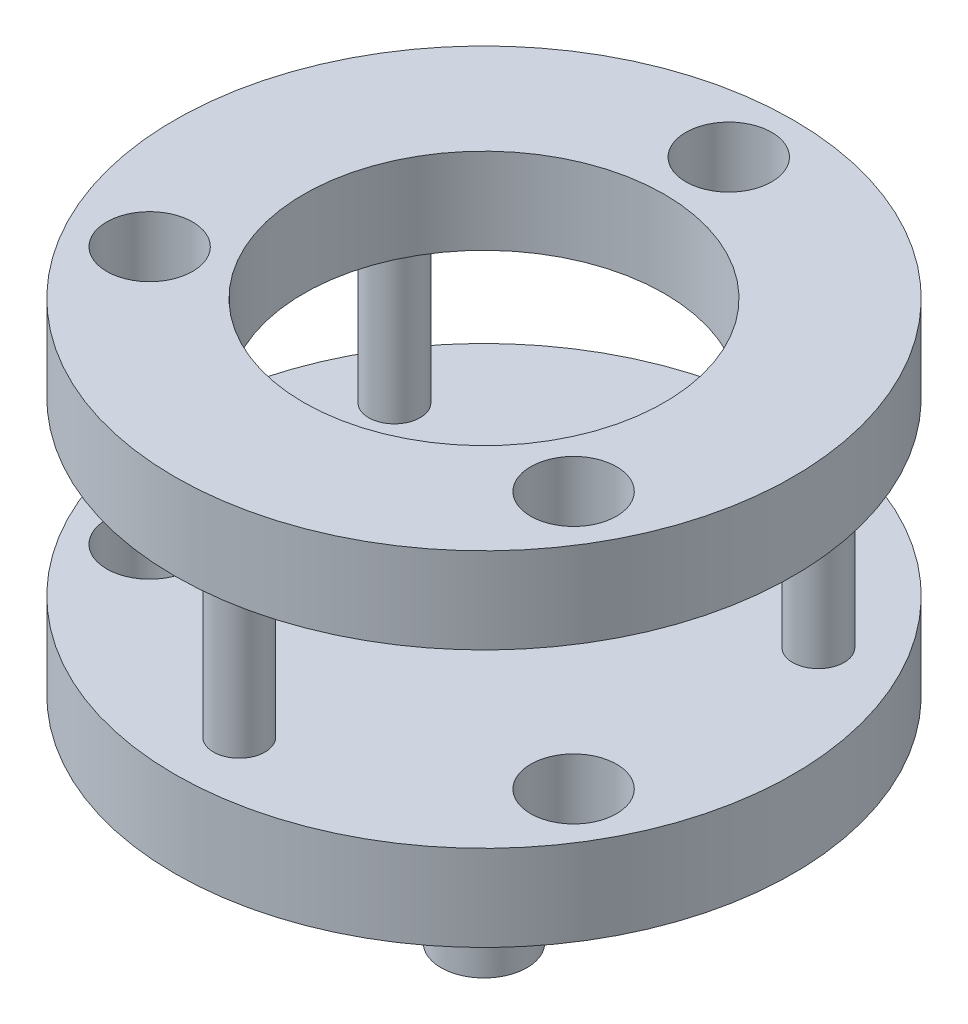
ISO-10303-21;
HEADER;
FILE_DESCRIPTION(('STEP AP214'),'2;1');
FILE_NAME('part.step','',(''),(''),'','','');
FILE_SCHEMA(('AUTOMOTIVE_DESIGN { 1 0 10303 214 1 1 1 1 }'));
ENDSEC;
DATA;
#1=APPLICATION_CONTEXT('core data for automotive mechanical design processes');
#2=APPLICATION_PROTOCOL_DEFINITION('international standard','automotive_design',2000,#1);
#3=PRODUCT_CONTEXT('',#1,'mechanical');
#4=PRODUCT('Part','Part','',(#3));
#5=PRODUCT_RELATED_PRODUCT_CATEGORY('part','',(#4));
#6=PRODUCT_DEFINITION_FORMATION('','',#4);
#7=PRODUCT_DEFINITION_CONTEXT('part definition',#1,'design');
#8=PRODUCT_DEFINITION('design','',#6,#7);
#9=PRODUCT_DEFINITION_SHAPE('','',#8);
#10=(LENGTH_UNIT() NAMED_UNIT(*) SI_UNIT(.MILLI.,.METRE.));
#11=(NAMED_UNIT(*) PLANE_ANGLE_UNIT() SI_UNIT($,.RADIAN.));
#12=(NAMED_UNIT(*) SI_UNIT($,.STERADIAN.) SOLID_ANGLE_UNIT());
#13=UNCERTAINTY_MEASURE_WITH_UNIT(LENGTH_MEASURE(1.E-05),#10,'distance_accuracy_value','');
#14=(GEOMETRIC_REPRESENTATION_CONTEXT(3) GLOBAL_UNCERTAINTY_ASSIGNED_CONTEXT((#13)) GLOBAL_UNIT_ASSIGNED_CONTEXT((#10,
#11,#12)) REPRESENTATION_CONTEXT('',''));
#15=CARTESIAN_POINT('',(0.,0.,0.));
#16=DIRECTION('',(0.,0.,1.));
#17=DIRECTION('',(1.,0.,0.));
#18=AXIS2_PLACEMENT_3D('',#15,#16,#17);
#19=CARTESIAN_POINT('',(24.6817240078567,40.,-14.2500000000001));
#20=DIRECTION('',(0.,-1.,0.));
#21=DIRECTION('',(0.,0.,-1.));
#22=AXIS2_PLACEMENT_3D('',#19,#20,#21);
#23=CYLINDRICAL_SURFACE('',#22,2.99999999999999);
#24=CARTESIAN_POINT('',(24.6817240078567,10.,-14.2500000000001));
#25=DIRECTION('',(0.,1.,0.));
#26=DIRECTION('',(0.,0.,1.));
#27=AXIS2_PLACEMENT_3D('',#24,#25,#26);
#28=CIRCLE('',#27,2.99999999999999);
#29=CARTESIAN_POINT('',(24.6817240078567,10.,-11.2500000000001));
#30=VERTEX_POINT('',#29);
#31=EDGE_CURVE('E78',#30,#30,#28,.T.);
#32=ORIENTED_EDGE('',*,*,#31,.T.);
#33=EDGE_LOOP('',(#32));
#34=FACE_BOUND('',#33,.T.);
#35=CARTESIAN_POINT('',(24.6817240078567,30.,-14.2500000000001));
#36=DIRECTION('',(0.,1.,0.));
#37=DIRECTION('',(0.,0.,1.));
#38=AXIS2_PLACEMENT_3D('',#35,#36,#37);
#39=CIRCLE('',#38,2.99999999999999);
#40=CARTESIAN_POINT('',(24.6817240078567,30.,-11.2500000000001));
#41=VERTEX_POINT('',#40);
#42=EDGE_CURVE('E58',#41,#41,#39,.T.);
#43=ORIENTED_EDGE('',*,*,#42,.F.);
#44=EDGE_LOOP('',(#43));
#45=FACE_BOUND('',#44,.T.);
#46=ADVANCED_FACE('F45',(#34,#45),#23,.T.);
#47=CARTESIAN_POINT('',(-24.6817240078567,40.,-14.2500000000001));
#48=DIRECTION('',(0.,-1.,0.));
#49=DIRECTION('',(0.,0.,-1.));
#50=AXIS2_PLACEMENT_3D('',#47,#48,#49);
#51=CYLINDRICAL_SURFACE('',#50,3.);
#52=CARTESIAN_POINT('',(-24.6817240078567,10.,-14.2500000000001));
#53=DIRECTION('',(0.,1.,0.));
#54=DIRECTION('',(0.,0.,1.));
#55=AXIS2_PLACEMENT_3D('',#52,#53,#54);
#56=CIRCLE('',#55,3.);
#57=CARTESIAN_POINT('',(-24.6817240078567,10.,-11.2500000000001));
#58=VERTEX_POINT('',#57);
#59=EDGE_CURVE('E99',#58,#58,#56,.T.);
#60=ORIENTED_EDGE('',*,*,#59,.T.);
#61=EDGE_LOOP('',(#60));
#62=FACE_BOUND('',#61,.T.);
#63=CARTESIAN_POINT('',(-24.6817240078567,30.,-14.2500000000001));
#64=DIRECTION('',(0.,1.,0.));
#65=DIRECTION('',(0.,0.,1.));
#66=AXIS2_PLACEMENT_3D('',#63,#64,#65);
#67=CIRCLE('',#66,3.);
#68=CARTESIAN_POINT('',(-24.6817240078567,30.,-11.2500000000001));
#69=VERTEX_POINT('',#68);
#70=EDGE_CURVE('E63',#69,#69,#67,.T.);
#71=ORIENTED_EDGE('',*,*,#70,.F.);
#72=EDGE_LOOP('',(#71));
#73=FACE_BOUND('',#72,.T.);
#74=ADVANCED_FACE('F180',(#62,#73),#51,.T.);
#75=CARTESIAN_POINT('',(0.,40.,28.5000000000002));
#76=DIRECTION('',(0.,-1.,0.));
#77=DIRECTION('',(0.,0.,-1.));
#78=AXIS2_PLACEMENT_3D('',#75,#76,#77);
#79=CYLINDRICAL_SURFACE('',#78,3.);
#80=CARTESIAN_POINT('',(0.,10.,28.5000000000002));
#81=DIRECTION('',(0.,1.,0.));
#82=DIRECTION('',(0.,0.,1.));
#83=AXIS2_PLACEMENT_3D('',#80,#81,#82);
#84=CIRCLE('',#83,3.);
#85=CARTESIAN_POINT('',(0.,10.,31.5000000000002));
#86=VERTEX_POINT('',#85);
#87=EDGE_CURVE('E107',#86,#86,#84,.T.);
#88=ORIENTED_EDGE('',*,*,#87,.T.);
#89=EDGE_LOOP('',(#88));
#90=FACE_BOUND('',#89,.T.);
#91=CARTESIAN_POINT('',(0.,30.,28.5000000000002));
#92=DIRECTION('',(0.,1.,0.));
#93=DIRECTION('',(0.,0.,1.));
#94=AXIS2_PLACEMENT_3D('',#91,#92,#93);
#95=CIRCLE('',#94,3.);
#96=CARTESIAN_POINT('',(0.,30.,31.5000000000002));
#97=VERTEX_POINT('',#96);
#98=EDGE_CURVE('E69',#97,#97,#95,.T.);
#99=ORIENTED_EDGE('',*,*,#98,.F.);
#100=EDGE_LOOP('',(#99));
#101=FACE_BOUND('',#100,.T.);
#102=ADVANCED_FACE('F187',(#90,#101),#79,.T.);
#103=CARTESIAN_POINT('',(0.,10.,0.));
#104=DIRECTION('',(0.,-1.,0.));
#105=DIRECTION('',(0.,0.,-1.));
#106=AXIS2_PLACEMENT_3D('',#103,#104,#105);
#107=CYLINDRICAL_SURFACE('',#106,36.0000000000002);
#108=CARTESIAN_POINT('',(0.,10.,0.));
#109=DIRECTION('',(0.,1.,0.));
#110=DIRECTION('',(0.,0.,1.));
#111=AXIS2_PLACEMENT_3D('',#108,#109,#110);
#112=CIRCLE('',#111,36.0000000000002);
#113=CARTESIAN_POINT('',(0.,10.,36.0000000000002));
#114=VERTEX_POINT('',#113);
#115=EDGE_CURVE('E73',#114,#114,#112,.T.);
#116=ORIENTED_EDGE('',*,*,#115,.F.);
#117=EDGE_LOOP('',(#116));
#118=FACE_BOUND('',#117,.T.);
#119=CARTESIAN_POINT('',(0.,0.,0.));
#120=DIRECTION('',(0.,1.,0.));
#121=DIRECTION('',(0.,0.,1.));
#122=AXIS2_PLACEMENT_3D('',#119,#120,#121);
#123=CIRCLE('',#122,36.0000000000002);
#124=CARTESIAN_POINT('',(0.,0.,36.0000000000002));
#125=VERTEX_POINT('',#124);
#126=EDGE_CURVE('E74',#125,#125,#123,.T.);
#127=ORIENTED_EDGE('',*,*,#126,.T.);
#128=EDGE_LOOP('',(#127));
#129=FACE_BOUND('',#128,.T.);
#130=ADVANCED_FACE('F201',(#118,#129),#107,.T.);
#131=CARTESIAN_POINT('',(0.,10.,-28.5000000000003));
#132=DIRECTION('',(0.,-1.,0.));
#133=DIRECTION('',(0.,0.,-1.));
#134=AXIS2_PLACEMENT_3D('',#131,#132,#133);
#135=CYLINDRICAL_SURFACE('',#134,5.00000000000001);
#136=CARTESIAN_POINT('',(0.,10.,-28.5000000000003));
#137=DIRECTION('',(0.,1.,0.));
#138=DIRECTION('',(0.,0.,1.));
#139=AXIS2_PLACEMENT_3D('',#136,#137,#138);
#140=CIRCLE('',#139,5.00000000000001);
#141=CARTESIAN_POINT('',(0.,10.,-23.5000000000003));
#142=VERTEX_POINT('',#141);
#143=EDGE_CURVE('E95',#142,#142,#140,.T.);
#144=ORIENTED_EDGE('',*,*,#143,.T.);
#145=EDGE_LOOP('',(#144));
#146=FACE_BOUND('',#145,.T.);
#147=CARTESIAN_POINT('',(0.,0.,-28.5000000000003));
#148=DIRECTION('',(0.,1.,0.));
#149=DIRECTION('',(0.,0.,1.));
#150=AXIS2_PLACEMENT_3D('',#147,#148,#149);
#151=CIRCLE('',#150,5.00000000000001);
#152=CARTESIAN_POINT('',(0.,0.,-23.5000000000003));
#153=VERTEX_POINT('',#152);
#154=EDGE_CURVE('E79',#153,#153,#151,.T.);
#155=ORIENTED_EDGE('',*,*,#154,.F.);
#156=EDGE_LOOP('',(#155));
#157=FACE_BOUND('',#156,.T.);
#158=ADVANCED_FACE('F204',(#146,#157),#135,.F.);
#159=CARTESIAN_POINT('',(-24.6817240078564,10.,14.2500000000001));
#160=DIRECTION('',(0.,-1.,0.));
#161=DIRECTION('',(0.,0.,-1.));
#162=AXIS2_PLACEMENT_3D('',#159,#160,#161);
#163=CYLINDRICAL_SURFACE('',#162,5.);
#164=CARTESIAN_POINT('',(-24.6817240078564,10.,14.2500000000001));
#165=DIRECTION('',(0.,1.,0.));
#166=DIRECTION('',(0.,0.,1.));
#167=AXIS2_PLACEMENT_3D('',#164,#165,#166);
#168=CIRCLE('',#167,5.);
#169=CARTESIAN_POINT('',(-24.6817240078564,10.,19.2500000000001));
#170=VERTEX_POINT('',#169);
#171=EDGE_CURVE('E103',#170,#170,#168,.T.);
#172=ORIENTED_EDGE('',*,*,#171,.T.);
#173=EDGE_LOOP('',(#172));
#174=FACE_BOUND('',#173,.T.);
#175=CARTESIAN_POINT('',(-24.6817240078564,0.,14.2500000000001));
#176=DIRECTION('',(0.,1.,0.));
#177=DIRECTION('',(0.,0.,1.));
#178=AXIS2_PLACEMENT_3D('',#175,#176,#177);
#179=CIRCLE('',#178,5.);
#180=CARTESIAN_POINT('',(-24.6817240078564,0.,19.2500000000001));
#181=VERTEX_POINT('',#180);
#182=EDGE_CURVE('E83',#181,#181,#179,.T.);
#183=ORIENTED_EDGE('',*,*,#182,.F.);
#184=EDGE_LOOP('',(#183));
#185=FACE_BOUND('',#184,.T.);
#186=ADVANCED_FACE('F208',(#174,#185),#163,.F.);
#187=CARTESIAN_POINT('',(24.6817240078568,10.,14.2499999999999));
#188=DIRECTION('',(0.,-1.,0.));
#189=DIRECTION('',(0.,0.,-1.));
#190=AXIS2_PLACEMENT_3D('',#187,#188,#189);
#191=CYLINDRICAL_SURFACE('',#190,5.00000000000002);
#192=CARTESIAN_POINT('',(24.6817240078568,10.,14.2499999999999));
#193=DIRECTION('',(0.,1.,0.));
#194=DIRECTION('',(0.,0.,1.));
#195=AXIS2_PLACEMENT_3D('',#192,#193,#194);
#196=CIRCLE('',#195,5.00000000000002);
#197=CARTESIAN_POINT('',(24.6817240078568,10.,19.2499999999999));
#198=VERTEX_POINT('',#197);
#199=EDGE_CURVE('E111',#198,#198,#196,.T.);
#200=ORIENTED_EDGE('',*,*,#199,.T.);
#201=EDGE_LOOP('',(#200));
#202=FACE_BOUND('',#201,.T.);
#203=CARTESIAN_POINT('',(24.6817240078568,0.,14.2499999999999));
#204=DIRECTION('',(0.,1.,0.));
#205=DIRECTION('',(0.,0.,1.));
#206=AXIS2_PLACEMENT_3D('',#203,#204,#205);
#207=CIRCLE('',#206,5.00000000000002);
#208=CARTESIAN_POINT('',(24.6817240078568,0.,19.2499999999999));
#209=VERTEX_POINT('',#208);
#210=EDGE_CURVE('E87',#209,#209,#207,.T.);
#211=ORIENTED_EDGE('',*,*,#210,.F.);
#212=EDGE_LOOP('',(#211));
#213=FACE_BOUND('',#212,.T.);
#214=ADVANCED_FACE('F197',(#202,#213),#191,.F.);
#215=CARTESIAN_POINT('',(0.,10.,0.));
#216=DIRECTION('',(0.,1.,0.));
#217=DIRECTION('',(0.,0.,1.));
#218=AXIS2_PLACEMENT_3D('',#215,#216,#217);
#219=PLANE('',#218);
#220=ORIENTED_EDGE('',*,*,#31,.F.);
#221=EDGE_LOOP('',(#220));
#222=FACE_BOUND('',#221,.T.);
#223=ORIENTED_EDGE('',*,*,#199,.F.);
#224=EDGE_LOOP('',(#223));
#225=FACE_BOUND('',#224,.T.);
#226=ORIENTED_EDGE('',*,*,#87,.F.);
#227=EDGE_LOOP('',(#226));
#228=FACE_BOUND('',#227,.T.);
#229=ORIENTED_EDGE('',*,*,#171,.F.);
#230=EDGE_LOOP('',(#229));
#231=FACE_BOUND('',#230,.T.);
#232=ORIENTED_EDGE('',*,*,#59,.F.);
#233=EDGE_LOOP('',(#232));
#234=FACE_BOUND('',#233,.T.);
#235=ORIENTED_EDGE('',*,*,#143,.F.);
#236=EDGE_LOOP('',(#235));
#237=FACE_BOUND('',#236,.T.);
#238=ORIENTED_EDGE('',*,*,#115,.T.);
#239=EDGE_LOOP('',(#238));
#240=FACE_BOUND('',#239,.T.);
#241=ADVANCED_FACE('F193',(#222,#225,#228,#231,#234,#237,#240),#219,.T.);
#242=CARTESIAN_POINT('',(0.,0.,0.));
#243=DIRECTION('',(0.,1.,0.));
#244=DIRECTION('',(0.,0.,1.));
#245=AXIS2_PLACEMENT_3D('',#242,#243,#244);
#246=PLANE('',#245);
#247=CARTESIAN_POINT('',(0.,0.,0.));
#248=DIRECTION('',(0.,1.,0.));
#249=DIRECTION('',(0.,0.,1.));
#250=AXIS2_PLACEMENT_3D('',#247,#248,#249);
#251=CIRCLE('',#250,15.);
#252=CARTESIAN_POINT('',(0.,0.,15.));
#253=VERTEX_POINT('',#252);
#254=EDGE_CURVE('E10',#253,#253,#251,.T.);
#255=ORIENTED_EDGE('',*,*,#254,.T.);
#256=EDGE_LOOP('',(#255));
#257=FACE_BOUND('',#256,.T.);
#258=ORIENTED_EDGE('',*,*,#210,.T.);
#259=EDGE_LOOP('',(#258));
#260=FACE_BOUND('',#259,.T.);
#261=ORIENTED_EDGE('',*,*,#182,.T.);
#262=EDGE_LOOP('',(#261));
#263=FACE_BOUND('',#262,.T.);
#264=ORIENTED_EDGE('',*,*,#154,.T.);
#265=EDGE_LOOP('',(#264));
#266=FACE_BOUND('',#265,.T.);
#267=ORIENTED_EDGE('',*,*,#126,.F.);
#268=EDGE_LOOP('',(#267));
#269=FACE_BOUND('',#268,.T.);
#270=ADVANCED_FACE('F196',(#257,#260,#263,#266,#269),#246,.F.);
#271=CARTESIAN_POINT('',(0.,40.,0.));
#272=DIRECTION('',(0.,-1.,0.));
#273=DIRECTION('',(0.,0.,-1.));
#274=AXIS2_PLACEMENT_3D('',#271,#272,#273);
#275=CYLINDRICAL_SURFACE('',#274,36.0000000000002);
#276=CARTESIAN_POINT('',(0.,40.,0.));
#277=DIRECTION('',(0.,1.,0.));
#278=DIRECTION('',(0.,0.,1.));
#279=AXIS2_PLACEMENT_3D('',#276,#277,#278);
#280=CIRCLE('',#279,36.0000000000002);
#281=CARTESIAN_POINT('',(0.,40.,36.0000000000002));
#282=VERTEX_POINT('',#281);
#283=EDGE_CURVE('E143',#282,#282,#280,.T.);
#284=ORIENTED_EDGE('',*,*,#283,.F.);
#285=EDGE_LOOP('',(#284));
#286=FACE_BOUND('',#285,.T.);
#287=CARTESIAN_POINT('',(0.,30.,0.));
#288=DIRECTION('',(0.,1.,0.));
#289=DIRECTION('',(0.,0.,1.));
#290=AXIS2_PLACEMENT_3D('',#287,#288,#289);
#291=CIRCLE('',#290,36.0000000000002);
#292=CARTESIAN_POINT('',(0.,30.,36.0000000000002));
#293=VERTEX_POINT('',#292);
#294=EDGE_CURVE('E123',#293,#293,#291,.T.);
#295=ORIENTED_EDGE('',*,*,#294,.T.);
#296=EDGE_LOOP('',(#295));
#297=FACE_BOUND('',#296,.T.);
#298=ADVANCED_FACE('F200',(#286,#297),#275,.T.);
#299=CARTESIAN_POINT('',(0.,40.,-28.5000000000003));
#300=DIRECTION('',(0.,-1.,0.));
#301=DIRECTION('',(0.,0.,-1.));
#302=AXIS2_PLACEMENT_3D('',#299,#300,#301);
#303=CYLINDRICAL_SURFACE('',#302,5.00000000000001);
#304=CARTESIAN_POINT('',(0.,40.,-28.5000000000003));
#305=DIRECTION('',(0.,1.,0.));
#306=DIRECTION('',(0.,0.,1.));
#307=AXIS2_PLACEMENT_3D('',#304,#305,#306);
#308=CIRCLE('',#307,5.00000000000001);
#309=CARTESIAN_POINT('',(0.,40.,-23.5000000000003));
#310=VERTEX_POINT('',#309);
#311=EDGE_CURVE('E147',#310,#310,#308,.T.);
#312=ORIENTED_EDGE('',*,*,#311,.T.);
#313=EDGE_LOOP('',(#312));
#314=FACE_BOUND('',#313,.T.);
#315=CARTESIAN_POINT('',(0.,30.,-28.5000000000003));
#316=DIRECTION('',(0.,1.,0.));
#317=DIRECTION('',(0.,0.,1.));
#318=AXIS2_PLACEMENT_3D('',#315,#316,#317);
#319=CIRCLE('',#318,5.00000000000001);
#320=CARTESIAN_POINT('',(0.,30.,-23.5000000000003));
#321=VERTEX_POINT('',#320);
#322=EDGE_CURVE('E127',#321,#321,#319,.T.);
#323=ORIENTED_EDGE('',*,*,#322,.F.);
#324=EDGE_LOOP('',(#323));
#325=FACE_BOUND('',#324,.T.);
#326=ADVANCED_FACE('F265',(#314,#325),#303,.F.);
#327=CARTESIAN_POINT('',(-24.6817240078564,40.,14.2500000000001));
#328=DIRECTION('',(0.,-1.,0.));
#329=DIRECTION('',(0.,0.,-1.));
#330=AXIS2_PLACEMENT_3D('',#327,#328,#329);
#331=CYLINDRICAL_SURFACE('',#330,5.);
#332=CARTESIAN_POINT('',(-24.6817240078564,40.,14.2500000000001));
#333=DIRECTION('',(0.,1.,0.));
#334=DIRECTION('',(0.,0.,1.));
#335=AXIS2_PLACEMENT_3D('',#332,#333,#334);
#336=CIRCLE('',#335,5.);
#337=CARTESIAN_POINT('',(-24.6817240078564,40.,19.2500000000001));
#338=VERTEX_POINT('',#337);
#339=EDGE_CURVE('E151',#338,#338,#336,.T.);
#340=ORIENTED_EDGE('',*,*,#339,.T.);
#341=EDGE_LOOP('',(#340));
#342=FACE_BOUND('',#341,.T.);
#343=CARTESIAN_POINT('',(-24.6817240078564,30.,14.2500000000001));
#344=DIRECTION('',(0.,1.,0.));
#345=DIRECTION('',(0.,0.,1.));
#346=AXIS2_PLACEMENT_3D('',#343,#344,#345);
#347=CIRCLE('',#346,5.);
#348=CARTESIAN_POINT('',(-24.6817240078564,30.,19.2500000000001));
#349=VERTEX_POINT('',#348);
#350=EDGE_CURVE('E131',#349,#349,#347,.T.);
#351=ORIENTED_EDGE('',*,*,#350,.F.);
#352=EDGE_LOOP('',(#351));
#353=FACE_BOUND('',#352,.T.);
#354=ADVANCED_FACE('F259',(#342,#353),#331,.F.);
#355=CARTESIAN_POINT('',(24.6817240078568,40.,14.2499999999999));
#356=DIRECTION('',(0.,-1.,0.));
#357=DIRECTION('',(0.,0.,-1.));
#358=AXIS2_PLACEMENT_3D('',#355,#356,#357);
#359=CYLINDRICAL_SURFACE('',#358,5.00000000000002);
#360=CARTESIAN_POINT('',(24.6817240078568,40.,14.2499999999999));
#361=DIRECTION('',(0.,1.,0.));
#362=DIRECTION('',(0.,0.,1.));
#363=AXIS2_PLACEMENT_3D('',#360,#361,#362);
#364=CIRCLE('',#363,5.00000000000002);
#365=CARTESIAN_POINT('',(24.6817240078568,40.,19.2499999999999));
#366=VERTEX_POINT('',#365);
#367=EDGE_CURVE('E122',#366,#366,#364,.T.);
#368=ORIENTED_EDGE('',*,*,#367,.T.);
#369=EDGE_LOOP('',(#368));
#370=FACE_BOUND('',#369,.T.);
#371=CARTESIAN_POINT('',(24.6817240078568,30.,14.2499999999999));
#372=DIRECTION('',(0.,1.,0.));
#373=DIRECTION('',(0.,0.,1.));
#374=AXIS2_PLACEMENT_3D('',#371,#372,#373);
#375=CIRCLE('',#374,5.00000000000002);
#376=CARTESIAN_POINT('',(24.6817240078568,30.,19.2499999999999));
#377=VERTEX_POINT('',#376);
#378=EDGE_CURVE('E135',#377,#377,#375,.T.);
#379=ORIENTED_EDGE('',*,*,#378,.F.);
#380=EDGE_LOOP('',(#379));
#381=FACE_BOUND('',#380,.T.);
#382=ADVANCED_FACE('F253',(#370,#381),#359,.F.);
#383=CARTESIAN_POINT('',(0.,40.,0.));
#384=DIRECTION('',(0.,-1.,0.));
#385=DIRECTION('',(0.,0.,-1.));
#386=AXIS2_PLACEMENT_3D('',#383,#384,#385);
#387=CYLINDRICAL_SURFACE('',#386,21.0000000000002);
#388=CARTESIAN_POINT('',(0.,40.,0.));
#389=DIRECTION('',(0.,1.,0.));
#390=DIRECTION('',(0.,0.,1.));
#391=AXIS2_PLACEMENT_3D('',#388,#389,#390);
#392=CIRCLE('',#391,21.0000000000002);
#393=CARTESIAN_POINT('',(0.,40.,21.0000000000002));
#394=VERTEX_POINT('',#393);
#395=EDGE_CURVE('E91',#394,#394,#392,.T.);
#396=ORIENTED_EDGE('',*,*,#395,.T.);
#397=EDGE_LOOP('',(#396));
#398=FACE_BOUND('',#397,.T.);
#399=CARTESIAN_POINT('',(0.,30.,0.));
#400=DIRECTION('',(0.,1.,0.));
#401=DIRECTION('',(0.,0.,1.));
#402=AXIS2_PLACEMENT_3D('',#399,#400,#401);
#403=CIRCLE('',#402,21.0000000000002);
#404=CARTESIAN_POINT('',(0.,30.,21.0000000000002));
#405=VERTEX_POINT('',#404);
#406=EDGE_CURVE('E118',#405,#405,#403,.T.);
#407=ORIENTED_EDGE('',*,*,#406,.F.);
#408=EDGE_LOOP('',(#407));
#409=FACE_BOUND('',#408,.T.);
#410=ADVANCED_FACE('F244',(#398,#409),#387,.F.);
#411=CARTESIAN_POINT('',(0.,30.,0.));
#412=DIRECTION('',(0.,1.,0.));
#413=DIRECTION('',(0.,0.,1.));
#414=AXIS2_PLACEMENT_3D('',#411,#412,#413);
#415=PLANE('',#414);
#416=ORIENTED_EDGE('',*,*,#42,.T.);
#417=EDGE_LOOP('',(#416));
#418=FACE_BOUND('',#417,.T.);
#419=ORIENTED_EDGE('',*,*,#378,.T.);
#420=EDGE_LOOP('',(#419));
#421=FACE_BOUND('',#420,.T.);
#422=ORIENTED_EDGE('',*,*,#98,.T.);
#423=EDGE_LOOP('',(#422));
#424=FACE_BOUND('',#423,.T.);
#425=ORIENTED_EDGE('',*,*,#350,.T.);
#426=EDGE_LOOP('',(#425));
#427=FACE_BOUND('',#426,.T.);
#428=ORIENTED_EDGE('',*,*,#70,.T.);
#429=EDGE_LOOP('',(#428));
#430=FACE_BOUND('',#429,.T.);
#431=ORIENTED_EDGE('',*,*,#322,.T.);
#432=EDGE_LOOP('',(#431));
#433=FACE_BOUND('',#432,.T.);
#434=ORIENTED_EDGE('',*,*,#294,.F.);
#435=EDGE_LOOP('',(#434));
#436=FACE_BOUND('',#435,.T.);
#437=ORIENTED_EDGE('',*,*,#406,.T.);
#438=EDGE_LOOP('',(#437));
#439=FACE_BOUND('',#438,.T.);
#440=ADVANCED_FACE('F175',(#418,#421,#424,#427,#430,#433,#436,#439),#415,.F.);
#441=CARTESIAN_POINT('',(0.,40.,28.5000000000002));
#442=DIRECTION('',(0.,1.,0.));
#443=DIRECTION('',(0.,0.,1.));
#444=AXIS2_PLACEMENT_3D('',#441,#442,#443);
#445=PLANE('',#444);
#446=ORIENTED_EDGE('',*,*,#367,.F.);
#447=EDGE_LOOP('',(#446));
#448=FACE_BOUND('',#447,.T.);
#449=ORIENTED_EDGE('',*,*,#339,.F.);
#450=EDGE_LOOP('',(#449));
#451=FACE_BOUND('',#450,.T.);
#452=ORIENTED_EDGE('',*,*,#311,.F.);
#453=EDGE_LOOP('',(#452));
#454=FACE_BOUND('',#453,.T.);
#455=ORIENTED_EDGE('',*,*,#283,.T.);
#456=EDGE_LOOP('',(#455));
#457=FACE_BOUND('',#456,.T.);
#458=ORIENTED_EDGE('',*,*,#395,.F.);
#459=EDGE_LOOP('',(#458));
#460=FACE_BOUND('',#459,.T.);
#461=ADVANCED_FACE('F166',(#448,#451,#454,#457,#460),#445,.T.);
#462=CARTESIAN_POINT('',(0.,-25.,0.));
#463=DIRECTION('',(0.,1.,0.));
#464=DIRECTION('',(0.,0.,1.));
#465=AXIS2_PLACEMENT_3D('',#462,#463,#464);
#466=CYLINDRICAL_SURFACE('',#465,5.);
#467=CARTESIAN_POINT('',(0.,-10.,0.));
#468=DIRECTION('',(0.,1.,0.));
#469=DIRECTION('',(0.,0.,1.));
#470=AXIS2_PLACEMENT_3D('',#467,#468,#469);
#471=CIRCLE('',#470,5.);
#472=CARTESIAN_POINT('',(0.,-10.,5.));
#473=VERTEX_POINT('',#472);
#474=EDGE_CURVE('E53',#473,#473,#471,.F.);
#475=ORIENTED_EDGE('',*,*,#474,.T.);
#476=EDGE_LOOP('',(#475));
#477=FACE_BOUND('',#476,.T.);
#478=CARTESIAN_POINT('',(0.,-25.,0.));
#479=DIRECTION('',(0.,-1.,0.));
#480=DIRECTION('',(0.,0.,-1.));
#481=AXIS2_PLACEMENT_3D('',#478,#479,#480);
#482=CIRCLE('',#481,5.);
#483=CARTESIAN_POINT('',(0.,-25.,-5.));
#484=VERTEX_POINT('',#483);
#485=EDGE_CURVE('E139',#484,#484,#482,.T.);
#486=ORIENTED_EDGE('',*,*,#485,.F.);
#487=EDGE_LOOP('',(#486));
#488=FACE_BOUND('',#487,.T.);
#489=ADVANCED_FACE('F164',(#477,#488),#466,.T.);
#490=CARTESIAN_POINT('',(0.,-25.,0.));
#491=DIRECTION('',(0.,-1.,0.));
#492=DIRECTION('',(0.,0.,-1.));
#493=AXIS2_PLACEMENT_3D('',#490,#491,#492);
#494=PLANE('',#493);
#495=ORIENTED_EDGE('',*,*,#485,.T.);
#496=EDGE_LOOP('',(#495));
#497=FACE_BOUND('',#496,.T.);
#498=ADVANCED_FACE('F162',(#497),#494,.T.);
#499=CARTESIAN_POINT('',(0.,-10.,0.));
#500=DIRECTION('',(0.,1.,0.));
#501=DIRECTION('',(0.,0.,1.));
#502=AXIS2_PLACEMENT_3D('',#499,#500,#501);
#503=TOROIDAL_SURFACE('',#502,15.,10.);
#504=ORIENTED_EDGE('',*,*,#254,.F.);
#505=EDGE_LOOP('',(#504));
#506=FACE_BOUND('',#505,.T.);
#507=ORIENTED_EDGE('',*,*,#474,.F.);
#508=EDGE_LOOP('',(#507));
#509=FACE_BOUND('',#508,.T.);
#510=ADVANCED_FACE('F47',(#506,#509),#503,.F.);
#511=CLOSED_SHELL('',(#46,#74,#102,#130,#158,#186,#214,#241,#270,#298,#326,#354,#382,#410,#440,
#461,#489,#498,#510));
#512=MANIFOLD_SOLID_BREP('B2',#511);
#513=ADVANCED_BREP_SHAPE_REPRESENTATION('',(#18,#512),#14);
#514=SHAPE_DEFINITION_REPRESENTATION(#9,#513);
ENDSEC;
END-ISO-10303-21;
